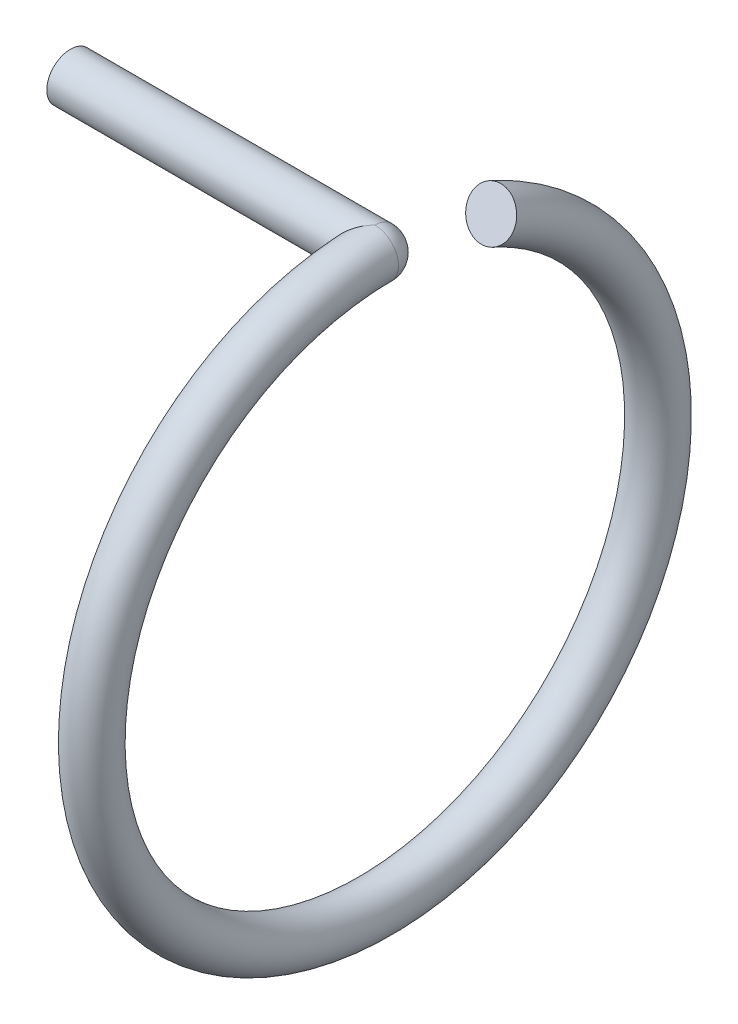
ISO-10303-21;
HEADER;
FILE_DESCRIPTION(('STEP AP214'),'2;1');
FILE_NAME('part.step','',(''),(''),'','','');
FILE_SCHEMA(('AUTOMOTIVE_DESIGN { 1 0 10303 214 1 1 1 1 }'));
ENDSEC;
DATA;
#1=APPLICATION_CONTEXT('core data for automotive mechanical design processes');
#2=APPLICATION_PROTOCOL_DEFINITION('international standard','automotive_design',2000,#1);
#3=PRODUCT_CONTEXT('',#1,'mechanical');
#4=PRODUCT('Part','Part','',(#3));
#5=PRODUCT_RELATED_PRODUCT_CATEGORY('part','',(#4));
#6=PRODUCT_DEFINITION_FORMATION('','',#4);
#7=PRODUCT_DEFINITION_CONTEXT('part definition',#1,'design');
#8=PRODUCT_DEFINITION('design','',#6,#7);
#9=PRODUCT_DEFINITION_SHAPE('','',#8);
#10=(LENGTH_UNIT() NAMED_UNIT(*) SI_UNIT(.MILLI.,.METRE.));
#11=(NAMED_UNIT(*) PLANE_ANGLE_UNIT() SI_UNIT($,.RADIAN.));
#12=(NAMED_UNIT(*) SI_UNIT($,.STERADIAN.) SOLID_ANGLE_UNIT());
#13=UNCERTAINTY_MEASURE_WITH_UNIT(LENGTH_MEASURE(1.E-05),#10,'distance_accuracy_value','');
#14=(GEOMETRIC_REPRESENTATION_CONTEXT(3) GLOBAL_UNCERTAINTY_ASSIGNED_CONTEXT((#13)) GLOBAL_UNIT_ASSIGNED_CONTEXT((#10,
#11,#12)) REPRESENTATION_CONTEXT('',''));
#15=CARTESIAN_POINT('',(0.,0.,0.));
#16=DIRECTION('',(0.,0.,1.));
#17=DIRECTION('',(1.,0.,0.));
#18=AXIS2_PLACEMENT_3D('',#15,#16,#17);
#19=CARTESIAN_POINT('',(0.,0.,0.));
#20=DIRECTION('',(1.,0.,0.));
#21=DIRECTION('',(0.,0.,-1.));
#22=AXIS2_PLACEMENT_3D('',#19,#20,#21);
#23=TOROIDAL_SURFACE('',#22,38.1,3.175);
#24=CARTESIAN_POINT('',(0.,34.7389228045351,-15.646636775376));
#25=DIRECTION('',(0.,0.410672881243464,0.911782750775201));
#26=DIRECTION('',(1.,0.,0.));
#27=AXIS2_PLACEMENT_3D('',#24,#25,#26);
#28=CIRCLE('',#27,3.175);
#29=CARTESIAN_POINT('',(3.175,34.7389228045351,-15.646636775376));
#30=VERTEX_POINT('',#29);
#31=EDGE_CURVE('E57',#30,#30,#28,.T.);
#32=ORIENTED_EDGE('',*,*,#31,.F.);
#33=EDGE_LOOP('',(#32));
#34=FACE_BOUND('',#33,.T.);
#35=CARTESIAN_POINT('',(0.,38.1,0.));
#36=DIRECTION('',(0.,0.,1.));
#37=DIRECTION('',(1.,0.,0.));
#38=AXIS2_PLACEMENT_3D('',#35,#36,#37);
#39=CIRCLE('',#38,3.175);
#40=CARTESIAN_POINT('',(0.,34.925,0.));
#41=VERTEX_POINT('',#40);
#42=CARTESIAN_POINT('',(0.,41.275,0.));
#43=VERTEX_POINT('',#42);
#44=EDGE_CURVE('E67',#41,#43,#39,.T.);
#45=ORIENTED_EDGE('',*,*,#44,.T.);
#46=CARTESIAN_POINT('',(0.,41.275,0.));
#47=CARTESIAN_POINT('',(-0.00270874984476919,41.2750000002982,0.00281935630808646));
#48=CARTESIAN_POINT('',(-0.00541758539473559,41.27499624497,0.00563880173940728));
#49=CARTESIAN_POINT('',(-0.238801106228482,41.2743490867798,0.248551969089132));
#50=CARTESIAN_POINT('',(-0.470051976236381,41.2464716289937,0.489236757652847));
#51=CARTESIAN_POINT('',(-0.812424934009013,41.163050905323,0.844533590378017));
#52=CARTESIAN_POINT('',(-0.925995693114976,41.1282111628761,0.962213987456866));
#53=CARTESIAN_POINT('',(-1.15082125637004,41.0442647702228,1.1946428112733));
#54=CARTESIAN_POINT('',(-1.26207715058407,40.995165005796,1.30939262408481));
#55=CARTESIAN_POINT('',(-1.53545533057422,40.8543731361151,1.5904553371449));
#56=CARTESIAN_POINT('',(-1.69559380817219,40.7536186687466,1.75427775850581));
#57=CARTESIAN_POINT('',(-2.00390736640669,40.5176023485567,2.06739958737567));
#58=CARTESIAN_POINT('',(-2.15210791493975,40.382416662163,2.2167300588264));
#59=CARTESIAN_POINT('',(-2.39425751868076,40.1154465004239,2.45806616536437));
#60=CARTESIAN_POINT('',(-2.49233183176579,39.9918033086649,2.55491552977748));
#61=CARTESIAN_POINT('',(-2.67455285550883,39.7243360228375,2.7327365398084));
#62=CARTESIAN_POINT('',(-2.75871701336396,39.5805376340759,2.81372809944194));
#63=CARTESIAN_POINT('',(-2.89264685782556,39.3057130457604,2.94020636805125));
#64=CARTESIAN_POINT('',(-2.94592678665656,39.1781926420015,2.98957166230132));
#65=CARTESIAN_POINT('',(-3.03761851773608,38.912835998687,3.07231837267051));
#66=CARTESIAN_POINT('',(-3.07603967056972,38.7750063121271,3.10570984421632));
#67=CARTESIAN_POINT('',(-3.12044636631832,38.5626339873701,3.1419494029293));
#68=CARTESIAN_POINT('',(-3.13307081025911,38.4905696401304,3.15173355729031));
#69=CARTESIAN_POINT('',(-3.15351516942723,38.3452792760793,3.1663512923817));
#70=CARTESIAN_POINT('',(-3.1613374550325,38.2720538507243,3.17118731633));
#71=CARTESIAN_POINT('',(-3.17195407529595,38.1250993212646,3.17575136553671));
#72=CARTESIAN_POINT('',(-3.17474995357781,38.0513703787758,3.17548095928763));
#73=CARTESIAN_POINT('',(-3.17521833130273,37.9041182789921,3.16980975125368));
#74=CARTESIAN_POINT('',(-3.17289140532464,37.8305950995448,3.16440952487318));
#75=CARTESIAN_POINT('',(-3.15942589520488,37.6295799100391,3.14258235808569));
#76=CARTESIAN_POINT('',(-3.14299026334191,37.5029384593172,3.12092455048929));
#77=CARTESIAN_POINT('',(-3.09531768540508,37.2559494300572,3.06338591215742));
#78=CARTESIAN_POINT('',(-3.06407889717593,37.1356026369181,3.02750331133102));
#79=CARTESIAN_POINT('',(-2.987822006445,36.9013136653818,2.942720723105));
#80=CARTESIAN_POINT('',(-2.94254119899756,36.7875473726906,2.89357509766381));
#81=CARTESIAN_POINT('',(-2.84065554525697,36.5705655517382,2.78499671910599));
#82=CARTESIAN_POINT('',(-2.78404550881233,36.4673548920951,2.72555925277486));
#83=CARTESIAN_POINT('',(-2.62843909787739,36.2190334874166,2.56414936715243));
#84=CARTESIAN_POINT('',(-2.52309761053687,36.0815261722396,2.4565816202825));
#85=CARTESIAN_POINT('',(-2.29700353292874,35.832124291579,2.22846995736848));
#86=CARTESIAN_POINT('',(-2.17620950248709,35.7203009455802,2.10789129034386));
#87=CARTESIAN_POINT('',(-1.9604505823853,35.5494567656575,1.89427566304637));
#88=CARTESIAN_POINT('',(-1.86804604348421,35.4844985948271,1.8032888119405));
#89=CARTESIAN_POINT('',(-1.67911660149256,35.3660493139079,1.61809428979991));
#90=CARTESIAN_POINT('',(-1.58258976885484,35.312563645955,1.52388511467225));
#91=CARTESIAN_POINT('',(-1.386459570349,35.2164619101431,1.33313236121873));
#92=CARTESIAN_POINT('',(-1.28685528655553,35.1738491211703,1.23658808829433));
#93=CARTESIAN_POINT('',(-1.08544591576496,35.0990033659465,1.04188121435558));
#94=CARTESIAN_POINT('',(-0.983641467166583,35.0667674307826,0.943719084689135));
#95=CARTESIAN_POINT('',(-0.737443437131101,35.0013444962274,0.706776169669152));
#96=CARTESIAN_POINT('',(-0.59229760110543,34.9729314236762,0.567448678540862));
#97=CARTESIAN_POINT('',(-0.300789603824793,34.934952149147,0.287987447384307));
#98=CARTESIAN_POINT('',(-0.154430009173193,34.92535312258,0.14785554012389));
#99=CARTESIAN_POINT('',(-0.00542669256450495,34.9250031929317,0.00519566267355968));
#100=CARTESIAN_POINT('',(-0.00271333173845981,34.9250000047734,0.00259781742022076));
#101=CARTESIAN_POINT('',(0.,34.9249999999999,0.));
#102=B_SPLINE_CURVE_WITH_KNOTS('',3,(#46,#47,#48,#49,#50,#51,#52,#53,#54,#55,#56,#57,#58,#59,
#60,#61,#62,#63,#64,#65,#66,#67,#68,#69,#70,#71,#72,#73,#74,#75,#76,#77,#78,#79,#80,#81,#82,#83,
#84,#85,#86,#87,#88,#89,#90,#91,#92,#93,#94,#95,#96,#97,#98,#99,#100,#101),.UNSPECIFIED.,.F.,
.F.,(4,2,2,2,2,2,2,2,2,2,2,2,2,2,2,2,2,2,2,2,2,2,2,2,2,2,2,4),(0.,0.0117295976176309,
1.01055026385516,1.5117378919478,2.01268391129119,2.76076910314036,3.50721359051995,
4.0608472258709,4.61378109256551,5.05239940096902,5.49074123723197,5.7119023697284,
5.93295424763016,6.15393822828107,6.37489742441109,6.76145977619662,7.14807024575791,
7.54240102086659,7.93691286221595,8.54521460034093,9.15518327442868,9.58976013209158,
10.0245426834512,10.4594561957235,10.8942451644375,11.5028902432022,12.1104724792741,
12.1217419110032),.UNSPECIFIED.);
#103=EDGE_CURVE('E11',#43,#41,#102,.T.);
#104=ORIENTED_EDGE('',*,*,#103,.T.);
#105=EDGE_LOOP('',(#45,#104));
#106=FACE_BOUND('',#105,.T.);
#107=ADVANCED_FACE('F43',(#34,#106),#23,.T.);
#108=CARTESIAN_POINT('',(0.,34.7389228045351,-15.646636775376));
#109=DIRECTION('',(0.,0.410672881243464,0.911782750775201));
#110=DIRECTION('',(1.,0.,0.));
#111=AXIS2_PLACEMENT_3D('',#108,#109,#110);
#112=PLANE('',#111);
#113=ORIENTED_EDGE('',*,*,#31,.T.);
#114=EDGE_LOOP('',(#113));
#115=FACE_BOUND('',#114,.T.);
#116=ADVANCED_FACE('F45',(#115),#112,.T.);
#117=CARTESIAN_POINT('',(-40.9763962719612,38.1,0.));
#118=DIRECTION('',(1.,0.,0.));
#119=DIRECTION('',(0.,0.,-1.));
#120=AXIS2_PLACEMENT_3D('',#117,#118,#119);
#121=PLANE('',#120);
#122=CARTESIAN_POINT('',(-40.9763962719612,38.1,0.));
#123=DIRECTION('',(1.,0.,0.));
#124=DIRECTION('',(0.,0.,-1.));
#125=AXIS2_PLACEMENT_3D('',#122,#123,#124);
#126=CIRCLE('',#125,3.175);
#127=CARTESIAN_POINT('',(-40.9763962719612,38.1,-3.175));
#128=VERTEX_POINT('',#127);
#129=EDGE_CURVE('E70',#128,#128,#126,.T.);
#130=ORIENTED_EDGE('',*,*,#129,.F.);
#131=EDGE_LOOP('',(#130));
#132=FACE_BOUND('',#131,.T.);
#133=ADVANCED_FACE('F89',(#132),#121,.F.);
#134=CARTESIAN_POINT('',(0.,38.1,0.));
#135=DIRECTION('',(-1.,0.,0.));
#136=DIRECTION('',(0.,0.,1.));
#137=AXIS2_PLACEMENT_3D('',#134,#135,#136);
#138=CYLINDRICAL_SURFACE('',#137,3.175);
#139=ORIENTED_EDGE('',*,*,#103,.F.);
#140=CARTESIAN_POINT('',(0.,38.1,0.));
#141=DIRECTION('',(1.,0.,0.));
#142=DIRECTION('',(0.,0.,-1.));
#143=AXIS2_PLACEMENT_3D('',#140,#141,#142);
#144=CIRCLE('',#143,3.175);
#145=EDGE_CURVE('E63',#41,#43,#144,.T.);
#146=ORIENTED_EDGE('',*,*,#145,.F.);
#147=EDGE_LOOP('',(#139,#146));
#148=FACE_BOUND('',#147,.T.);
#149=ORIENTED_EDGE('',*,*,#129,.T.);
#150=EDGE_LOOP('',(#149));
#151=FACE_BOUND('',#150,.T.);
#152=ADVANCED_FACE('F72',(#148,#151),#138,.T.);
#153=CARTESIAN_POINT('',(0.,38.1,0.));
#154=DIRECTION('',(0.,-1.,0.));
#155=DIRECTION('',(0.,0.,1.));
#156=AXIS2_PLACEMENT_3D('',#153,#154,#155);
#157=SPHERICAL_SURFACE('',#156,3.175);
#158=ORIENTED_EDGE('',*,*,#44,.F.);
#159=ORIENTED_EDGE('',*,*,#145,.T.);
#160=EDGE_LOOP('',(#158,#159));
#161=FACE_BOUND('',#160,.T.);
#162=ADVANCED_FACE('F74',(#161),#157,.T.);
#163=CLOSED_SHELL('',(#107,#116,#133,#152,#162));
#164=MANIFOLD_SOLID_BREP('B2',#163);
#165=ADVANCED_BREP_SHAPE_REPRESENTATION('',(#18,#164),#14);
#166=SHAPE_DEFINITION_REPRESENTATION(#9,#165);
ENDSEC;
END-ISO-10303-21;
